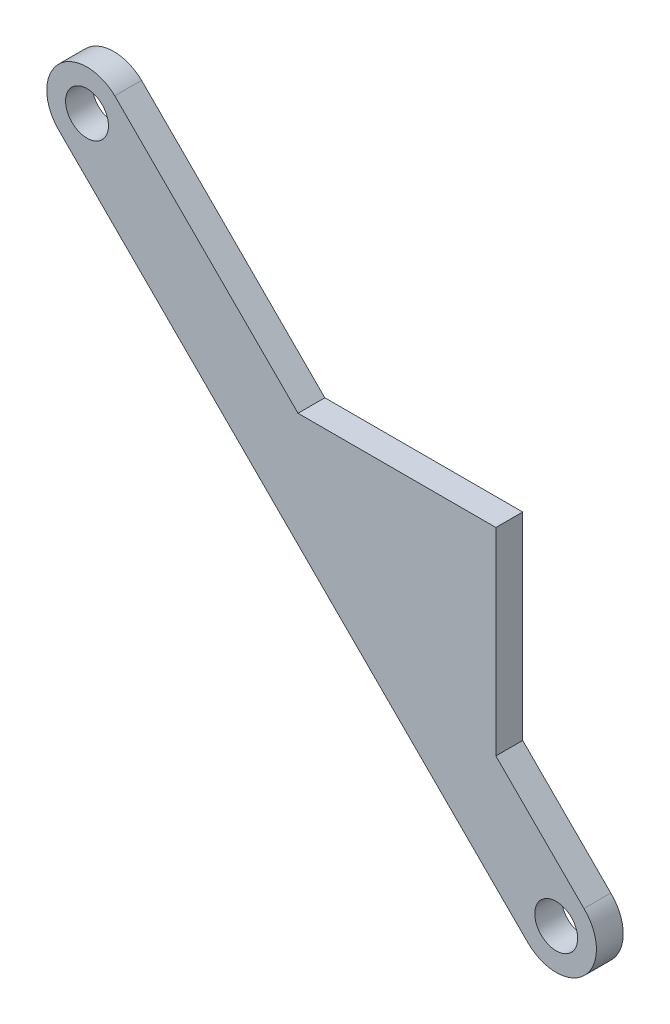
ISO-10303-21;
HEADER;
FILE_DESCRIPTION(('STEP AP214'),'2;1');
FILE_NAME('part.step','',(''),(''),'','','');
FILE_SCHEMA(('AUTOMOTIVE_DESIGN { 1 0 10303 214 1 1 1 1 }'));
ENDSEC;
DATA;
#1=APPLICATION_CONTEXT('core data for automotive mechanical design processes');
#2=APPLICATION_PROTOCOL_DEFINITION('international standard','automotive_design',2000,#1);
#3=PRODUCT_CONTEXT('',#1,'mechanical');
#4=PRODUCT('Part','Part','',(#3));
#5=PRODUCT_RELATED_PRODUCT_CATEGORY('part','',(#4));
#6=PRODUCT_DEFINITION_FORMATION('','',#4);
#7=PRODUCT_DEFINITION_CONTEXT('part definition',#1,'design');
#8=PRODUCT_DEFINITION('design','',#6,#7);
#9=PRODUCT_DEFINITION_SHAPE('','',#8);
#10=(LENGTH_UNIT() NAMED_UNIT(*) SI_UNIT(.MILLI.,.METRE.));
#11=(NAMED_UNIT(*) PLANE_ANGLE_UNIT() SI_UNIT($,.RADIAN.));
#12=(NAMED_UNIT(*) SI_UNIT($,.STERADIAN.) SOLID_ANGLE_UNIT());
#13=UNCERTAINTY_MEASURE_WITH_UNIT(LENGTH_MEASURE(1.E-05),#10,'distance_accuracy_value','');
#14=(GEOMETRIC_REPRESENTATION_CONTEXT(3) GLOBAL_UNCERTAINTY_ASSIGNED_CONTEXT((#13)) GLOBAL_UNIT_ASSIGNED_CONTEXT((#10,
#11,#12)) REPRESENTATION_CONTEXT('',''));
#15=CARTESIAN_POINT('',(0.,0.,0.));
#16=DIRECTION('',(0.,0.,1.));
#17=DIRECTION('',(1.,0.,0.));
#18=AXIS2_PLACEMENT_3D('',#15,#16,#17);
#19=CARTESIAN_POINT('',(2.12073442336176,2.12073442336176,2.));
#20=DIRECTION('',(-0.707106781186547,-0.707106781186548,0.));
#21=DIRECTION('',(0.707106781186548,-0.707106781186547,0.));
#22=AXIS2_PLACEMENT_3D('',#19,#20,#21);
#23=PLANE('',#22);
#24=DIRECTION('',(-0.707106781186548,0.707106781186547,0.));
#25=VECTOR('',#24,1.);
#26=CARTESIAN_POINT('',(2.12073442336176,2.12073442336176,0.));
#27=LINE('',#26,#25);
#28=CARTESIAN_POINT('',(-1.75853115327648,6.,0.));
#29=VERTEX_POINT('',#28);
#30=CARTESIAN_POINT('',(-15.4291204216232,19.6705892683467,0.));
#31=VERTEX_POINT('',#30);
#32=EDGE_CURVE('E133',#29,#31,#27,.T.);
#33=ORIENTED_EDGE('',*,*,#32,.T.);
#34=DIRECTION('',(0.,0.,-1.));
#35=VECTOR('',#34,1.);
#36=CARTESIAN_POINT('',(-15.4291204216232,19.6705892683467,2.));
#37=LINE('',#36,#35);
#38=CARTESIAN_POINT('',(-15.4291204216232,19.6705892683467,2.));
#39=VERTEX_POINT('',#38);
#40=EDGE_CURVE('E11',#39,#31,#37,.T.);
#41=ORIENTED_EDGE('',*,*,#40,.F.);
#42=DIRECTION('',(-0.707106781186548,0.707106781186547,0.));
#43=VECTOR('',#42,1.);
#44=CARTESIAN_POINT('',(2.12073442336176,2.12073442336176,2.));
#45=LINE('',#44,#43);
#46=CARTESIAN_POINT('',(-1.75853115327648,6.,2.));
#47=VERTEX_POINT('',#46);
#48=EDGE_CURVE('E168',#47,#39,#45,.T.);
#49=ORIENTED_EDGE('',*,*,#48,.F.);
#50=DIRECTION('',(0.,0.,-1.));
#51=VECTOR('',#50,1.);
#52=CARTESIAN_POINT('',(-1.75853115327648,6.,2.));
#53=LINE('',#52,#51);
#54=EDGE_CURVE('E52',#47,#29,#53,.T.);
#55=ORIENTED_EDGE('',*,*,#54,.T.);
#56=EDGE_LOOP('',(#33,#41,#49,#55));
#57=FACE_BOUND('',#56,.T.);
#58=ADVANCED_FACE('F35',(#57),#23,.F.);
#59=CARTESIAN_POINT('',(-17.5,17.5,2.));
#60=DIRECTION('',(0.,0.,-1.));
#61=DIRECTION('',(-1.,0.,0.));
#62=AXIS2_PLACEMENT_3D('',#59,#60,#61);
#63=CYLINDRICAL_SURFACE('',#62,3.);
#64=CARTESIAN_POINT('',(-17.5,17.5,0.));
#65=DIRECTION('',(0.,0.,1.));
#66=DIRECTION('',(1.,0.,0.));
#67=AXIS2_PLACEMENT_3D('',#64,#65,#66);
#68=CIRCLE('',#67,3.);
#69=CARTESIAN_POINT('',(-19.5708795783768,15.3294107316533,0.));
#70=VERTEX_POINT('',#69);
#71=EDGE_CURVE('E135',#31,#70,#68,.T.);
#72=ORIENTED_EDGE('',*,*,#71,.T.);
#73=DIRECTION('',(0.,0.,-1.));
#74=VECTOR('',#73,1.);
#75=CARTESIAN_POINT('',(-19.5708795783768,15.3294107316533,2.));
#76=LINE('',#75,#74);
#77=CARTESIAN_POINT('',(-19.5708795783768,15.3294107316533,2.));
#78=VERTEX_POINT('',#77);
#79=EDGE_CURVE('E44',#78,#70,#76,.T.);
#80=ORIENTED_EDGE('',*,*,#79,.F.);
#81=CARTESIAN_POINT('',(-17.5,17.5,2.));
#82=DIRECTION('',(0.,0.,1.));
#83=DIRECTION('',(1.,0.,0.));
#84=AXIS2_PLACEMENT_3D('',#81,#82,#83);
#85=CIRCLE('',#84,3.);
#86=EDGE_CURVE('E88',#39,#78,#85,.T.);
#87=ORIENTED_EDGE('',*,*,#86,.F.);
#88=ORIENTED_EDGE('',*,*,#40,.T.);
#89=EDGE_LOOP('',(#72,#80,#87,#88));
#90=FACE_BOUND('',#89,.T.);
#91=ADVANCED_FACE('F196',(#90),#63,.T.);
#92=CARTESIAN_POINT('',(-2.12073442336175,-2.12073442336175,2.));
#93=DIRECTION('',(0.707106781186547,0.707106781186547,0.));
#94=DIRECTION('',(-0.707106781186548,0.707106781186548,0.));
#95=AXIS2_PLACEMENT_3D('',#92,#93,#94);
#96=PLANE('',#95);
#97=DIRECTION('',(0.707106781186548,-0.707106781186548,0.));
#98=VECTOR('',#97,1.);
#99=CARTESIAN_POINT('',(-2.12073442336175,-2.12073442336175,0.));
#100=LINE('',#99,#98);
#101=CARTESIAN_POINT('',(15.4291204216232,-19.6705892683467,0.));
#102=VERTEX_POINT('',#101);
#103=EDGE_CURVE('E137',#70,#102,#100,.T.);
#104=ORIENTED_EDGE('',*,*,#103,.T.);
#105=DIRECTION('',(0.,0.,-1.));
#106=VECTOR('',#105,1.);
#107=CARTESIAN_POINT('',(15.4291204216232,-19.6705892683467,2.));
#108=LINE('',#107,#106);
#109=CARTESIAN_POINT('',(15.4291204216232,-19.6705892683467,2.));
#110=VERTEX_POINT('',#109);
#111=EDGE_CURVE('E151',#110,#102,#108,.T.);
#112=ORIENTED_EDGE('',*,*,#111,.F.);
#113=DIRECTION('',(0.707106781186548,-0.707106781186548,0.));
#114=VECTOR('',#113,1.);
#115=CARTESIAN_POINT('',(-2.12073442336175,-2.12073442336175,2.));
#116=LINE('',#115,#114);
#117=EDGE_CURVE('E159',#78,#110,#116,.T.);
#118=ORIENTED_EDGE('',*,*,#117,.F.);
#119=ORIENTED_EDGE('',*,*,#79,.T.);
#120=EDGE_LOOP('',(#104,#112,#118,#119));
#121=FACE_BOUND('',#120,.T.);
#122=ADVANCED_FACE('F157',(#121),#96,.F.);
#123=CARTESIAN_POINT('',(17.5,-17.5,2.));
#124=DIRECTION('',(0.,0.,-1.));
#125=DIRECTION('',(-1.,0.,0.));
#126=AXIS2_PLACEMENT_3D('',#123,#124,#125);
#127=CYLINDRICAL_SURFACE('',#126,3.);
#128=CARTESIAN_POINT('',(17.5,-17.5,0.));
#129=DIRECTION('',(0.,0.,1.));
#130=DIRECTION('',(1.,0.,0.));
#131=AXIS2_PLACEMENT_3D('',#128,#129,#130);
#132=CIRCLE('',#131,3.);
#133=CARTESIAN_POINT('',(19.5708795783768,-15.3294107316533,0.));
#134=VERTEX_POINT('',#133);
#135=EDGE_CURVE('E139',#102,#134,#132,.T.);
#136=ORIENTED_EDGE('',*,*,#135,.T.);
#137=DIRECTION('',(0.,0.,-1.));
#138=VECTOR('',#137,1.);
#139=CARTESIAN_POINT('',(19.5708795783768,-15.3294107316533,2.));
#140=LINE('',#139,#138);
#141=CARTESIAN_POINT('',(19.5708795783768,-15.3294107316533,2.));
#142=VERTEX_POINT('',#141);
#143=EDGE_CURVE('E119',#142,#134,#140,.T.);
#144=ORIENTED_EDGE('',*,*,#143,.F.);
#145=CARTESIAN_POINT('',(17.5,-17.5,2.));
#146=DIRECTION('',(0.,0.,1.));
#147=DIRECTION('',(1.,0.,0.));
#148=AXIS2_PLACEMENT_3D('',#145,#146,#147);
#149=CIRCLE('',#148,3.);
#150=EDGE_CURVE('E107',#110,#142,#149,.T.);
#151=ORIENTED_EDGE('',*,*,#150,.F.);
#152=ORIENTED_EDGE('',*,*,#111,.T.);
#153=EDGE_LOOP('',(#136,#144,#151,#152));
#154=FACE_BOUND('',#153,.T.);
#155=ADVANCED_FACE('F164',(#154),#127,.T.);
#156=CARTESIAN_POINT('',(2.12073442336177,2.12073442336177,2.));
#157=DIRECTION('',(-0.707106781186548,-0.707106781186547,0.));
#158=DIRECTION('',(0.707106781186547,-0.707106781186548,0.));
#159=AXIS2_PLACEMENT_3D('',#156,#157,#158);
#160=PLANE('',#159);
#161=DIRECTION('',(-0.707106781186547,0.707106781186548,0.));
#162=VECTOR('',#161,1.);
#163=CARTESIAN_POINT('',(2.12073442336177,2.12073442336177,0.));
#164=LINE('',#163,#162);
#165=CARTESIAN_POINT('',(13.,-8.75853115327647,0.));
#166=VERTEX_POINT('',#165);
#167=EDGE_CURVE('E116',#134,#166,#164,.T.);
#168=ORIENTED_EDGE('',*,*,#167,.T.);
#169=DIRECTION('',(0.,0.,-1.));
#170=VECTOR('',#169,1.);
#171=CARTESIAN_POINT('',(13.,-8.75853115327647,2.));
#172=LINE('',#171,#170);
#173=CARTESIAN_POINT('',(13.,-8.75853115327647,2.));
#174=VERTEX_POINT('',#173);
#175=EDGE_CURVE('E113',#174,#166,#172,.T.);
#176=ORIENTED_EDGE('',*,*,#175,.F.);
#177=DIRECTION('',(-0.707106781186547,0.707106781186548,0.));
#178=VECTOR('',#177,1.);
#179=CARTESIAN_POINT('',(2.12073442336177,2.12073442336177,2.));
#180=LINE('',#179,#178);
#181=EDGE_CURVE('E100',#142,#174,#180,.T.);
#182=ORIENTED_EDGE('',*,*,#181,.F.);
#183=ORIENTED_EDGE('',*,*,#143,.T.);
#184=EDGE_LOOP('',(#168,#176,#182,#183));
#185=FACE_BOUND('',#184,.T.);
#186=ADVANCED_FACE('F114',(#185),#160,.F.);
#187=CARTESIAN_POINT('',(13.,0.,2.));
#188=DIRECTION('',(-1.,0.,0.));
#189=DIRECTION('',(0.,0.,1.));
#190=AXIS2_PLACEMENT_3D('',#187,#188,#189);
#191=PLANE('',#190);
#192=DIRECTION('',(0.,1.,0.));
#193=VECTOR('',#192,1.);
#194=CARTESIAN_POINT('',(13.,0.,0.));
#195=LINE('',#194,#193);
#196=CARTESIAN_POINT('',(13.,6.,0.));
#197=VERTEX_POINT('',#196);
#198=EDGE_CURVE('E142',#166,#197,#195,.T.);
#199=ORIENTED_EDGE('',*,*,#198,.T.);
#200=DIRECTION('',(0.,0.,-1.));
#201=VECTOR('',#200,1.);
#202=CARTESIAN_POINT('',(13.,6.,2.));
#203=LINE('',#202,#201);
#204=CARTESIAN_POINT('',(13.,6.,2.));
#205=VERTEX_POINT('',#204);
#206=EDGE_CURVE('E76',#205,#197,#203,.T.);
#207=ORIENTED_EDGE('',*,*,#206,.F.);
#208=DIRECTION('',(0.,1.,0.));
#209=VECTOR('',#208,1.);
#210=CARTESIAN_POINT('',(13.,0.,2.));
#211=LINE('',#210,#209);
#212=EDGE_CURVE('E105',#174,#205,#211,.T.);
#213=ORIENTED_EDGE('',*,*,#212,.F.);
#214=ORIENTED_EDGE('',*,*,#175,.T.);
#215=EDGE_LOOP('',(#199,#207,#213,#214));
#216=FACE_BOUND('',#215,.T.);
#217=ADVANCED_FACE('F121',(#216),#191,.F.);
#218=CARTESIAN_POINT('',(17.5,-17.5,2.));
#219=DIRECTION('',(0.,0.,-1.));
#220=DIRECTION('',(-1.,0.,0.));
#221=AXIS2_PLACEMENT_3D('',#218,#219,#220);
#222=CYLINDRICAL_SURFACE('',#221,1.6);
#223=CARTESIAN_POINT('',(17.5,-17.5,2.));
#224=DIRECTION('',(0.,0.,1.));
#225=DIRECTION('',(1.,0.,0.));
#226=AXIS2_PLACEMENT_3D('',#223,#224,#225);
#227=CIRCLE('',#226,1.6);
#228=CARTESIAN_POINT('',(19.1,-17.5,2.));
#229=VERTEX_POINT('',#228);
#230=EDGE_CURVE('E170',#229,#229,#227,.T.);
#231=ORIENTED_EDGE('',*,*,#230,.T.);
#232=EDGE_LOOP('',(#231));
#233=FACE_BOUND('',#232,.T.);
#234=CARTESIAN_POINT('',(17.5,-17.5,0.));
#235=DIRECTION('',(0.,0.,1.));
#236=DIRECTION('',(1.,0.,0.));
#237=AXIS2_PLACEMENT_3D('',#234,#235,#236);
#238=CIRCLE('',#237,1.6);
#239=CARTESIAN_POINT('',(19.1,-17.5,0.));
#240=VERTEX_POINT('',#239);
#241=EDGE_CURVE('E130',#240,#240,#238,.T.);
#242=ORIENTED_EDGE('',*,*,#241,.F.);
#243=EDGE_LOOP('',(#242));
#244=FACE_BOUND('',#243,.T.);
#245=ADVANCED_FACE('F184',(#233,#244),#222,.F.);
#246=CARTESIAN_POINT('',(-17.5,17.5,2.));
#247=DIRECTION('',(0.,0.,-1.));
#248=DIRECTION('',(-1.,0.,0.));
#249=AXIS2_PLACEMENT_3D('',#246,#247,#248);
#250=CYLINDRICAL_SURFACE('',#249,1.6);
#251=CARTESIAN_POINT('',(-17.5,17.5,2.));
#252=DIRECTION('',(0.,0.,1.));
#253=DIRECTION('',(1.,0.,0.));
#254=AXIS2_PLACEMENT_3D('',#251,#252,#253);
#255=CIRCLE('',#254,1.6);
#256=CARTESIAN_POINT('',(-15.9,17.5,2.));
#257=VERTEX_POINT('',#256);
#258=EDGE_CURVE('E147',#257,#257,#255,.T.);
#259=ORIENTED_EDGE('',*,*,#258,.T.);
#260=EDGE_LOOP('',(#259));
#261=FACE_BOUND('',#260,.T.);
#262=CARTESIAN_POINT('',(-17.5,17.5,0.));
#263=DIRECTION('',(0.,0.,1.));
#264=DIRECTION('',(1.,0.,0.));
#265=AXIS2_PLACEMENT_3D('',#262,#263,#264);
#266=CIRCLE('',#265,1.6);
#267=CARTESIAN_POINT('',(-15.9,17.5,0.));
#268=VERTEX_POINT('',#267);
#269=EDGE_CURVE('E127',#268,#268,#266,.T.);
#270=ORIENTED_EDGE('',*,*,#269,.F.);
#271=EDGE_LOOP('',(#270));
#272=FACE_BOUND('',#271,.T.);
#273=ADVANCED_FACE('F37',(#261,#272),#250,.F.);
#274=CARTESIAN_POINT('',(0.,6.,2.));
#275=DIRECTION('',(0.,1.,0.));
#276=DIRECTION('',(0.,0.,1.));
#277=AXIS2_PLACEMENT_3D('',#274,#275,#276);
#278=PLANE('',#277);
#279=DIRECTION('',(1.,0.,0.));
#280=VECTOR('',#279,1.);
#281=CARTESIAN_POINT('',(0.,6.,0.));
#282=LINE('',#281,#280);
#283=EDGE_CURVE('E144',#29,#197,#282,.T.);
#284=ORIENTED_EDGE('',*,*,#283,.F.);
#285=ORIENTED_EDGE('',*,*,#54,.F.);
#286=DIRECTION('',(1.,0.,0.));
#287=VECTOR('',#286,1.);
#288=CARTESIAN_POINT('',(0.,6.,2.));
#289=LINE('',#288,#287);
#290=EDGE_CURVE('E122',#47,#205,#289,.T.);
#291=ORIENTED_EDGE('',*,*,#290,.T.);
#292=ORIENTED_EDGE('',*,*,#206,.T.);
#293=EDGE_LOOP('',(#284,#285,#291,#292));
#294=FACE_BOUND('',#293,.T.);
#295=ADVANCED_FACE('F180',(#294),#278,.T.);
#296=CARTESIAN_POINT('',(0.,0.,2.));
#297=DIRECTION('',(0.,0.,1.));
#298=DIRECTION('',(1.,0.,0.));
#299=AXIS2_PLACEMENT_3D('',#296,#297,#298);
#300=PLANE('',#299);
#301=ORIENTED_EDGE('',*,*,#258,.F.);
#302=EDGE_LOOP('',(#301));
#303=FACE_BOUND('',#302,.T.);
#304=ORIENTED_EDGE('',*,*,#230,.F.);
#305=EDGE_LOOP('',(#304));
#306=FACE_BOUND('',#305,.T.);
#307=ORIENTED_EDGE('',*,*,#48,.T.);
#308=ORIENTED_EDGE('',*,*,#86,.T.);
#309=ORIENTED_EDGE('',*,*,#117,.T.);
#310=ORIENTED_EDGE('',*,*,#150,.T.);
#311=ORIENTED_EDGE('',*,*,#181,.T.);
#312=ORIENTED_EDGE('',*,*,#212,.T.);
#313=ORIENTED_EDGE('',*,*,#290,.F.);
#314=EDGE_LOOP('',(#307,#308,#309,#310,#311,#312,#313));
#315=FACE_BOUND('',#314,.T.);
#316=ADVANCED_FACE('F102',(#303,#306,#315),#300,.T.);
#317=CARTESIAN_POINT('',(0.,0.,0.));
#318=DIRECTION('',(0.,0.,1.));
#319=DIRECTION('',(1.,0.,0.));
#320=AXIS2_PLACEMENT_3D('',#317,#318,#319);
#321=PLANE('',#320);
#322=ORIENTED_EDGE('',*,*,#269,.T.);
#323=EDGE_LOOP('',(#322));
#324=FACE_BOUND('',#323,.T.);
#325=ORIENTED_EDGE('',*,*,#241,.T.);
#326=EDGE_LOOP('',(#325));
#327=FACE_BOUND('',#326,.T.);
#328=ORIENTED_EDGE('',*,*,#32,.F.);
#329=ORIENTED_EDGE('',*,*,#283,.T.);
#330=ORIENTED_EDGE('',*,*,#198,.F.);
#331=ORIENTED_EDGE('',*,*,#167,.F.);
#332=ORIENTED_EDGE('',*,*,#135,.F.);
#333=ORIENTED_EDGE('',*,*,#103,.F.);
#334=ORIENTED_EDGE('',*,*,#71,.F.);
#335=EDGE_LOOP('',(#328,#329,#330,#331,#332,#333,#334));
#336=FACE_BOUND('',#335,.T.);
#337=ADVANCED_FACE('F162',(#324,#327,#336),#321,.F.);
#338=CLOSED_SHELL('',(#58,#91,#122,#155,#186,#217,#245,#273,#295,#316,#337));
#339=MANIFOLD_SOLID_BREP('B2',#338);
#340=ADVANCED_BREP_SHAPE_REPRESENTATION('',(#18,#339),#14);
#341=SHAPE_DEFINITION_REPRESENTATION(#9,#340);
ENDSEC;
END-ISO-10303-21;
